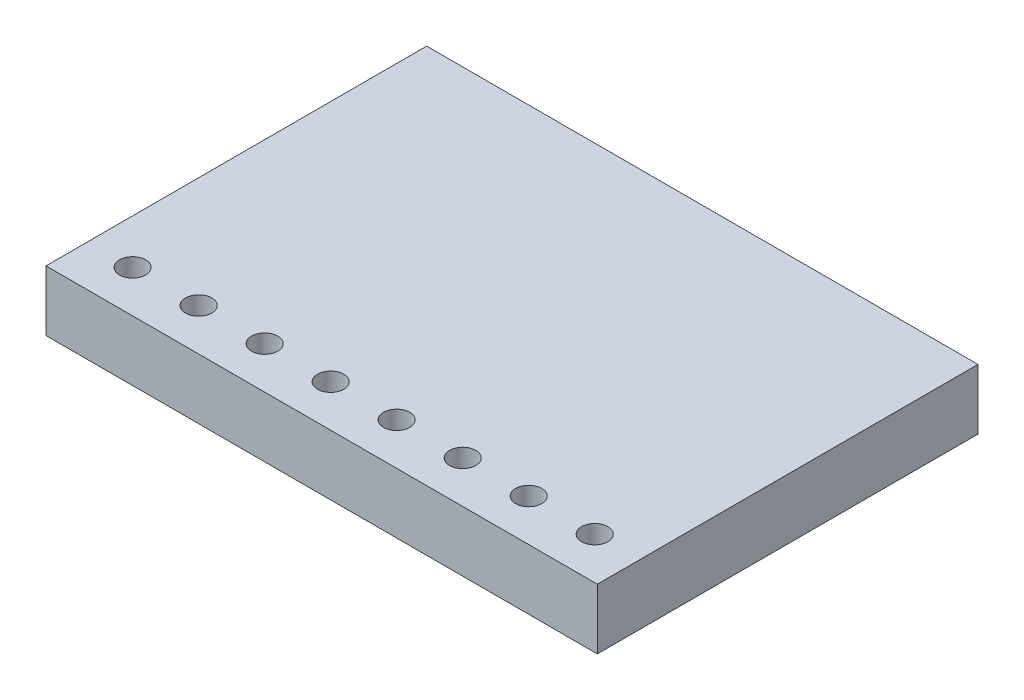
ISO-10303-21;
HEADER;
FILE_DESCRIPTION(('STEP AP214'),'2;1');
FILE_NAME('part.step','',(''),(''),'','','');
FILE_SCHEMA(('AUTOMOTIVE_DESIGN { 1 0 10303 214 1 1 1 1 }'));
ENDSEC;
DATA;
#1=APPLICATION_CONTEXT('core data for automotive mechanical design processes');
#2=APPLICATION_PROTOCOL_DEFINITION('international standard','automotive_design',2000,#1);
#3=PRODUCT_CONTEXT('',#1,'mechanical');
#4=PRODUCT('Part','Part','',(#3));
#5=PRODUCT_RELATED_PRODUCT_CATEGORY('part','',(#4));
#6=PRODUCT_DEFINITION_FORMATION('','',#4);
#7=PRODUCT_DEFINITION_CONTEXT('part definition',#1,'design');
#8=PRODUCT_DEFINITION('design','',#6,#7);
#9=PRODUCT_DEFINITION_SHAPE('','',#8);
#10=(LENGTH_UNIT() NAMED_UNIT(*) SI_UNIT(.MILLI.,.METRE.));
#11=(NAMED_UNIT(*) PLANE_ANGLE_UNIT() SI_UNIT($,.RADIAN.));
#12=(NAMED_UNIT(*) SI_UNIT($,.STERADIAN.) SOLID_ANGLE_UNIT());
#13=UNCERTAINTY_MEASURE_WITH_UNIT(LENGTH_MEASURE(1.E-05),#10,'distance_accuracy_value','');
#14=(GEOMETRIC_REPRESENTATION_CONTEXT(3) GLOBAL_UNCERTAINTY_ASSIGNED_CONTEXT((#13)) GLOBAL_UNIT_ASSIGNED_CONTEXT((#10,
#11,#12)) REPRESENTATION_CONTEXT('',''));
#15=CARTESIAN_POINT('',(0.,0.,0.));
#16=DIRECTION('',(0.,0.,1.));
#17=DIRECTION('',(1.,0.,0.));
#18=AXIS2_PLACEMENT_3D('',#15,#16,#17);
#19=CARTESIAN_POINT('',(10.5,2.3,7.24999999999999));
#20=DIRECTION('',(-1.,0.,0.));
#21=DIRECTION('',(0.,0.,1.));
#22=AXIS2_PLACEMENT_3D('',#19,#20,#21);
#23=PLANE('',#22);
#24=DIRECTION('',(0.,0.,-1.));
#25=VECTOR('',#24,1.);
#26=CARTESIAN_POINT('',(10.5,0.,7.24999999999999));
#27=LINE('',#26,#25);
#28=CARTESIAN_POINT('',(10.5,0.,7.24999999999999));
#29=VERTEX_POINT('',#28);
#30=CARTESIAN_POINT('',(10.5,0.,-7.25000000000001));
#31=VERTEX_POINT('',#30);
#32=EDGE_CURVE('E107',#29,#31,#27,.T.);
#33=ORIENTED_EDGE('',*,*,#32,.T.);
#34=DIRECTION('',(0.,-1.,0.));
#35=VECTOR('',#34,1.);
#36=CARTESIAN_POINT('',(10.5,2.3,-7.25000000000001));
#37=LINE('',#36,#35);
#38=CARTESIAN_POINT('',(10.5,2.3,-7.25000000000001));
#39=VERTEX_POINT('',#38);
#40=EDGE_CURVE('E11',#39,#31,#37,.T.);
#41=ORIENTED_EDGE('',*,*,#40,.F.);
#42=DIRECTION('',(0.,0.,-1.));
#43=VECTOR('',#42,1.);
#44=CARTESIAN_POINT('',(10.5,2.3,7.24999999999999));
#45=LINE('',#44,#43);
#46=CARTESIAN_POINT('',(10.5,2.3,7.24999999999999));
#47=VERTEX_POINT('',#46);
#48=EDGE_CURVE('E91',#47,#39,#45,.T.);
#49=ORIENTED_EDGE('',*,*,#48,.F.);
#50=DIRECTION('',(0.,-1.,0.));
#51=VECTOR('',#50,1.);
#52=CARTESIAN_POINT('',(10.5,2.3,7.24999999999999));
#53=LINE('',#52,#51);
#54=EDGE_CURVE('E103',#47,#29,#53,.T.);
#55=ORIENTED_EDGE('',*,*,#54,.T.);
#56=EDGE_LOOP('',(#33,#41,#49,#55));
#57=FACE_BOUND('',#56,.T.);
#58=ADVANCED_FACE('F39',(#57),#23,.F.);
#59=CARTESIAN_POINT('',(-10.5,2.3,-7.25000000000001));
#60=DIRECTION('',(0.,0.,1.));
#61=DIRECTION('',(1.,0.,0.));
#62=AXIS2_PLACEMENT_3D('',#59,#60,#61);
#63=PLANE('',#62);
#64=DIRECTION('',(-1.,0.,0.));
#65=VECTOR('',#64,1.);
#66=CARTESIAN_POINT('',(-10.5,0.,-7.25000000000001));
#67=LINE('',#66,#65);
#68=CARTESIAN_POINT('',(-10.5,0.,-7.25000000000001));
#69=VERTEX_POINT('',#68);
#70=EDGE_CURVE('E96',#31,#69,#67,.T.);
#71=ORIENTED_EDGE('',*,*,#70,.T.);
#72=DIRECTION('',(0.,-1.,0.));
#73=VECTOR('',#72,1.);
#74=CARTESIAN_POINT('',(-10.5,2.3,-7.25000000000001));
#75=LINE('',#74,#73);
#76=CARTESIAN_POINT('',(-10.5,2.3,-7.25000000000001));
#77=VERTEX_POINT('',#76);
#78=EDGE_CURVE('E48',#77,#69,#75,.T.);
#79=ORIENTED_EDGE('',*,*,#78,.F.);
#80=DIRECTION('',(-1.,0.,0.));
#81=VECTOR('',#80,1.);
#82=CARTESIAN_POINT('',(-10.5,2.3,-7.25000000000001));
#83=LINE('',#82,#81);
#84=EDGE_CURVE('E86',#39,#77,#83,.T.);
#85=ORIENTED_EDGE('',*,*,#84,.F.);
#86=ORIENTED_EDGE('',*,*,#40,.T.);
#87=EDGE_LOOP('',(#71,#79,#85,#86));
#88=FACE_BOUND('',#87,.T.);
#89=ADVANCED_FACE('F95',(#88),#63,.F.);
#90=CARTESIAN_POINT('',(-10.5,2.3,7.24999999999999));
#91=DIRECTION('',(1.,0.,0.));
#92=DIRECTION('',(0.,0.,-1.));
#93=AXIS2_PLACEMENT_3D('',#90,#91,#92);
#94=PLANE('',#93);
#95=DIRECTION('',(0.,0.,1.));
#96=VECTOR('',#95,1.);
#97=CARTESIAN_POINT('',(-10.5,0.,7.24999999999999));
#98=LINE('',#97,#96);
#99=CARTESIAN_POINT('',(-10.5,0.,7.24999999999999));
#100=VERTEX_POINT('',#99);
#101=EDGE_CURVE('E73',#69,#100,#98,.T.);
#102=ORIENTED_EDGE('',*,*,#101,.T.);
#103=DIRECTION('',(0.,-1.,0.));
#104=VECTOR('',#103,1.);
#105=CARTESIAN_POINT('',(-10.5,2.3,7.24999999999999));
#106=LINE('',#105,#104);
#107=CARTESIAN_POINT('',(-10.5,2.3,7.24999999999999));
#108=VERTEX_POINT('',#107);
#109=EDGE_CURVE('E98',#108,#100,#106,.T.);
#110=ORIENTED_EDGE('',*,*,#109,.F.);
#111=DIRECTION('',(0.,0.,1.));
#112=VECTOR('',#111,1.);
#113=CARTESIAN_POINT('',(-10.5,2.3,7.24999999999999));
#114=LINE('',#113,#112);
#115=EDGE_CURVE('E89',#77,#108,#114,.T.);
#116=ORIENTED_EDGE('',*,*,#115,.F.);
#117=ORIENTED_EDGE('',*,*,#78,.T.);
#118=EDGE_LOOP('',(#102,#110,#116,#117));
#119=FACE_BOUND('',#118,.T.);
#120=ADVANCED_FACE('F99',(#119),#94,.F.);
#121=CARTESIAN_POINT('',(-10.5,2.3,7.24999999999999));
#122=DIRECTION('',(0.,0.,-1.));
#123=DIRECTION('',(-1.,0.,0.));
#124=AXIS2_PLACEMENT_3D('',#121,#122,#123);
#125=PLANE('',#124);
#126=DIRECTION('',(1.,0.,0.));
#127=VECTOR('',#126,1.);
#128=CARTESIAN_POINT('',(-10.5,0.,7.24999999999999));
#129=LINE('',#128,#127);
#130=EDGE_CURVE('E79',#100,#29,#129,.T.);
#131=ORIENTED_EDGE('',*,*,#130,.T.);
#132=ORIENTED_EDGE('',*,*,#54,.F.);
#133=DIRECTION('',(1.,0.,0.));
#134=VECTOR('',#133,1.);
#135=CARTESIAN_POINT('',(-10.5,2.3,7.24999999999999));
#136=LINE('',#135,#134);
#137=EDGE_CURVE('E56',#108,#47,#136,.T.);
#138=ORIENTED_EDGE('',*,*,#137,.F.);
#139=ORIENTED_EDGE('',*,*,#109,.T.);
#140=EDGE_LOOP('',(#131,#132,#138,#139));
#141=FACE_BOUND('',#140,.T.);
#142=ADVANCED_FACE('F121',(#141),#125,.F.);
#143=CARTESIAN_POINT('',(0.,2.3,0.));
#144=DIRECTION('',(0.,-1.,0.));
#145=DIRECTION('',(0.,0.,-1.));
#146=AXIS2_PLACEMENT_3D('',#143,#144,#145);
#147=PLANE('',#146);
#148=CARTESIAN_POINT('',(-8.79999999999998,2.3,5.64999999999999));
#149=DIRECTION('',(0.,1.,0.));
#150=DIRECTION('',(0.,0.,1.));
#151=AXIS2_PLACEMENT_3D('',#148,#149,#150);
#152=CIRCLE('',#151,0.500000000000001);
#153=CARTESIAN_POINT('',(-8.79999999999998,2.3,6.14999999999999));
#154=VERTEX_POINT('',#153);
#155=EDGE_CURVE('E184',#154,#154,#152,.T.);
#156=ORIENTED_EDGE('',*,*,#155,.F.);
#157=EDGE_LOOP('',(#156));
#158=FACE_BOUND('',#157,.T.);
#159=CARTESIAN_POINT('',(-6.28571428571427,2.3,5.64999999999999));
#160=DIRECTION('',(0.,1.,0.));
#161=DIRECTION('',(0.,0.,1.));
#162=AXIS2_PLACEMENT_3D('',#159,#160,#161);
#163=CIRCLE('',#162,0.500000000000002);
#164=CARTESIAN_POINT('',(-6.28571428571427,2.3,6.14999999999999));
#165=VERTEX_POINT('',#164);
#166=EDGE_CURVE('E176',#165,#165,#163,.T.);
#167=ORIENTED_EDGE('',*,*,#166,.F.);
#168=EDGE_LOOP('',(#167));
#169=FACE_BOUND('',#168,.T.);
#170=CARTESIAN_POINT('',(-3.77142857142856,2.3,5.64999999999999));
#171=DIRECTION('',(0.,1.,0.));
#172=DIRECTION('',(0.,0.,1.));
#173=AXIS2_PLACEMENT_3D('',#170,#171,#172);
#174=CIRCLE('',#173,0.500000000000001);
#175=CARTESIAN_POINT('',(-3.77142857142856,2.3,6.14999999999999));
#176=VERTEX_POINT('',#175);
#177=EDGE_CURVE('E168',#176,#176,#174,.T.);
#178=ORIENTED_EDGE('',*,*,#177,.F.);
#179=EDGE_LOOP('',(#178));
#180=FACE_BOUND('',#179,.T.);
#181=CARTESIAN_POINT('',(-1.25714285714284,2.3,5.64999999999999));
#182=DIRECTION('',(0.,1.,0.));
#183=DIRECTION('',(0.,0.,1.));
#184=AXIS2_PLACEMENT_3D('',#181,#182,#183);
#185=CIRCLE('',#184,0.500000000000001);
#186=CARTESIAN_POINT('',(-1.25714285714284,2.3,6.14999999999999));
#187=VERTEX_POINT('',#186);
#188=EDGE_CURVE('E160',#187,#187,#185,.T.);
#189=ORIENTED_EDGE('',*,*,#188,.F.);
#190=EDGE_LOOP('',(#189));
#191=FACE_BOUND('',#190,.T.);
#192=CARTESIAN_POINT('',(1.25714285714287,2.3,5.64999999999999));
#193=DIRECTION('',(0.,1.,0.));
#194=DIRECTION('',(0.,0.,1.));
#195=AXIS2_PLACEMENT_3D('',#192,#193,#194);
#196=CIRCLE('',#195,0.500000000000001);
#197=CARTESIAN_POINT('',(1.25714285714287,2.3,6.14999999999999));
#198=VERTEX_POINT('',#197);
#199=EDGE_CURVE('E152',#198,#198,#196,.T.);
#200=ORIENTED_EDGE('',*,*,#199,.F.);
#201=EDGE_LOOP('',(#200));
#202=FACE_BOUND('',#201,.T.);
#203=CARTESIAN_POINT('',(3.77142857142859,2.3,5.64999999999999));
#204=DIRECTION('',(0.,1.,0.));
#205=DIRECTION('',(0.,0.,1.));
#206=AXIS2_PLACEMENT_3D('',#203,#204,#205);
#207=CIRCLE('',#206,0.500000000000001);
#208=CARTESIAN_POINT('',(3.77142857142859,2.3,6.14999999999999));
#209=VERTEX_POINT('',#208);
#210=EDGE_CURVE('E144',#209,#209,#207,.T.);
#211=ORIENTED_EDGE('',*,*,#210,.F.);
#212=EDGE_LOOP('',(#211));
#213=FACE_BOUND('',#212,.T.);
#214=CARTESIAN_POINT('',(6.2857142857143,2.3,5.64999999999999));
#215=DIRECTION('',(0.,1.,0.));
#216=DIRECTION('',(0.,0.,1.));
#217=AXIS2_PLACEMENT_3D('',#214,#215,#216);
#218=CIRCLE('',#217,0.500000000000001);
#219=CARTESIAN_POINT('',(6.2857142857143,2.3,6.14999999999999));
#220=VERTEX_POINT('',#219);
#221=EDGE_CURVE('E136',#220,#220,#218,.T.);
#222=ORIENTED_EDGE('',*,*,#221,.F.);
#223=EDGE_LOOP('',(#222));
#224=FACE_BOUND('',#223,.T.);
#225=CARTESIAN_POINT('',(8.80000000000002,2.3,5.64999999999999));
#226=DIRECTION('',(0.,1.,0.));
#227=DIRECTION('',(0.,0.,1.));
#228=AXIS2_PLACEMENT_3D('',#225,#226,#227);
#229=CIRCLE('',#228,0.500000000000001);
#230=CARTESIAN_POINT('',(8.80000000000002,2.3,6.14999999999999));
#231=VERTEX_POINT('',#230);
#232=EDGE_CURVE('E128',#231,#231,#229,.T.);
#233=ORIENTED_EDGE('',*,*,#232,.F.);
#234=EDGE_LOOP('',(#233));
#235=FACE_BOUND('',#234,.T.);
#236=ORIENTED_EDGE('',*,*,#48,.T.);
#237=ORIENTED_EDGE('',*,*,#84,.T.);
#238=ORIENTED_EDGE('',*,*,#115,.T.);
#239=ORIENTED_EDGE('',*,*,#137,.T.);
#240=EDGE_LOOP('',(#236,#237,#238,#239));
#241=FACE_BOUND('',#240,.T.);
#242=ADVANCED_FACE('F87',(#158,#169,#180,#191,#202,#213,#224,#235,#241),#147,.F.);
#243=CARTESIAN_POINT('',(0.,0.,0.));
#244=DIRECTION('',(0.,-1.,0.));
#245=DIRECTION('',(0.,0.,-1.));
#246=AXIS2_PLACEMENT_3D('',#243,#244,#245);
#247=PLANE('',#246);
#248=CARTESIAN_POINT('',(-8.79999999999998,0.,5.64999999999999));
#249=DIRECTION('',(0.,1.,0.));
#250=DIRECTION('',(0.,0.,1.));
#251=AXIS2_PLACEMENT_3D('',#248,#249,#250);
#252=CIRCLE('',#251,0.500000000000001);
#253=CARTESIAN_POINT('',(-8.79999999999998,0.,6.14999999999999));
#254=VERTEX_POINT('',#253);
#255=EDGE_CURVE('E111',#254,#254,#252,.T.);
#256=ORIENTED_EDGE('',*,*,#255,.T.);
#257=EDGE_LOOP('',(#256));
#258=FACE_BOUND('',#257,.T.);
#259=CARTESIAN_POINT('',(-6.28571428571427,0.,5.64999999999999));
#260=DIRECTION('',(0.,1.,0.));
#261=DIRECTION('',(0.,0.,1.));
#262=AXIS2_PLACEMENT_3D('',#259,#260,#261);
#263=CIRCLE('',#262,0.500000000000002);
#264=CARTESIAN_POINT('',(-6.28571428571427,0.,6.14999999999999));
#265=VERTEX_POINT('',#264);
#266=EDGE_CURVE('E180',#265,#265,#263,.T.);
#267=ORIENTED_EDGE('',*,*,#266,.T.);
#268=EDGE_LOOP('',(#267));
#269=FACE_BOUND('',#268,.T.);
#270=CARTESIAN_POINT('',(-3.77142857142856,0.,5.64999999999999));
#271=DIRECTION('',(0.,1.,0.));
#272=DIRECTION('',(0.,0.,1.));
#273=AXIS2_PLACEMENT_3D('',#270,#271,#272);
#274=CIRCLE('',#273,0.500000000000001);
#275=CARTESIAN_POINT('',(-3.77142857142856,0.,6.14999999999999));
#276=VERTEX_POINT('',#275);
#277=EDGE_CURVE('E172',#276,#276,#274,.T.);
#278=ORIENTED_EDGE('',*,*,#277,.T.);
#279=EDGE_LOOP('',(#278));
#280=FACE_BOUND('',#279,.T.);
#281=CARTESIAN_POINT('',(-1.25714285714284,0.,5.64999999999999));
#282=DIRECTION('',(0.,1.,0.));
#283=DIRECTION('',(0.,0.,1.));
#284=AXIS2_PLACEMENT_3D('',#281,#282,#283);
#285=CIRCLE('',#284,0.500000000000001);
#286=CARTESIAN_POINT('',(-1.25714285714284,0.,6.14999999999999));
#287=VERTEX_POINT('',#286);
#288=EDGE_CURVE('E164',#287,#287,#285,.T.);
#289=ORIENTED_EDGE('',*,*,#288,.T.);
#290=EDGE_LOOP('',(#289));
#291=FACE_BOUND('',#290,.T.);
#292=CARTESIAN_POINT('',(1.25714285714287,0.,5.64999999999999));
#293=DIRECTION('',(0.,1.,0.));
#294=DIRECTION('',(0.,0.,1.));
#295=AXIS2_PLACEMENT_3D('',#292,#293,#294);
#296=CIRCLE('',#295,0.500000000000001);
#297=CARTESIAN_POINT('',(1.25714285714287,0.,6.14999999999999));
#298=VERTEX_POINT('',#297);
#299=EDGE_CURVE('E156',#298,#298,#296,.T.);
#300=ORIENTED_EDGE('',*,*,#299,.T.);
#301=EDGE_LOOP('',(#300));
#302=FACE_BOUND('',#301,.T.);
#303=CARTESIAN_POINT('',(3.77142857142859,0.,5.64999999999999));
#304=DIRECTION('',(0.,1.,0.));
#305=DIRECTION('',(0.,0.,1.));
#306=AXIS2_PLACEMENT_3D('',#303,#304,#305);
#307=CIRCLE('',#306,0.500000000000001);
#308=CARTESIAN_POINT('',(3.77142857142859,0.,6.14999999999999));
#309=VERTEX_POINT('',#308);
#310=EDGE_CURVE('E148',#309,#309,#307,.T.);
#311=ORIENTED_EDGE('',*,*,#310,.T.);
#312=EDGE_LOOP('',(#311));
#313=FACE_BOUND('',#312,.T.);
#314=CARTESIAN_POINT('',(6.2857142857143,0.,5.64999999999999));
#315=DIRECTION('',(0.,1.,0.));
#316=DIRECTION('',(0.,0.,1.));
#317=AXIS2_PLACEMENT_3D('',#314,#315,#316);
#318=CIRCLE('',#317,0.500000000000001);
#319=CARTESIAN_POINT('',(6.2857142857143,0.,6.14999999999999));
#320=VERTEX_POINT('',#319);
#321=EDGE_CURVE('E140',#320,#320,#318,.T.);
#322=ORIENTED_EDGE('',*,*,#321,.T.);
#323=EDGE_LOOP('',(#322));
#324=FACE_BOUND('',#323,.T.);
#325=CARTESIAN_POINT('',(8.80000000000002,0.,5.64999999999999));
#326=DIRECTION('',(0.,1.,0.));
#327=DIRECTION('',(0.,0.,1.));
#328=AXIS2_PLACEMENT_3D('',#325,#326,#327);
#329=CIRCLE('',#328,0.500000000000001);
#330=CARTESIAN_POINT('',(8.80000000000002,0.,6.14999999999999));
#331=VERTEX_POINT('',#330);
#332=EDGE_CURVE('E132',#331,#331,#329,.T.);
#333=ORIENTED_EDGE('',*,*,#332,.T.);
#334=EDGE_LOOP('',(#333));
#335=FACE_BOUND('',#334,.T.);
#336=ORIENTED_EDGE('',*,*,#32,.F.);
#337=ORIENTED_EDGE('',*,*,#130,.F.);
#338=ORIENTED_EDGE('',*,*,#101,.F.);
#339=ORIENTED_EDGE('',*,*,#70,.F.);
#340=EDGE_LOOP('',(#336,#337,#338,#339));
#341=FACE_BOUND('',#340,.T.);
#342=ADVANCED_FACE('F124',(#258,#269,#280,#291,#302,#313,#324,#335,#341),#247,.T.);
#343=CARTESIAN_POINT('',(8.80000000000002,0.,5.64999999999999));
#344=DIRECTION('',(0.,1.,0.));
#345=DIRECTION('',(0.,0.,1.));
#346=AXIS2_PLACEMENT_3D('',#343,#344,#345);
#347=CYLINDRICAL_SURFACE('',#346,0.500000000000001);
#348=ORIENTED_EDGE('',*,*,#332,.F.);
#349=EDGE_LOOP('',(#348));
#350=FACE_BOUND('',#349,.T.);
#351=ORIENTED_EDGE('',*,*,#232,.T.);
#352=EDGE_LOOP('',(#351));
#353=FACE_BOUND('',#352,.T.);
#354=ADVANCED_FACE('F218',(#350,#353),#347,.F.);
#355=CARTESIAN_POINT('',(6.2857142857143,0.,5.64999999999999));
#356=DIRECTION('',(0.,1.,0.));
#357=DIRECTION('',(0.,0.,1.));
#358=AXIS2_PLACEMENT_3D('',#355,#356,#357);
#359=CYLINDRICAL_SURFACE('',#358,0.500000000000001);
#360=ORIENTED_EDGE('',*,*,#321,.F.);
#361=EDGE_LOOP('',(#360));
#362=FACE_BOUND('',#361,.T.);
#363=ORIENTED_EDGE('',*,*,#221,.T.);
#364=EDGE_LOOP('',(#363));
#365=FACE_BOUND('',#364,.T.);
#366=ADVANCED_FACE('F220',(#362,#365),#359,.F.);
#367=CARTESIAN_POINT('',(3.77142857142859,0.,5.64999999999999));
#368=DIRECTION('',(0.,1.,0.));
#369=DIRECTION('',(0.,0.,1.));
#370=AXIS2_PLACEMENT_3D('',#367,#368,#369);
#371=CYLINDRICAL_SURFACE('',#370,0.500000000000001);
#372=ORIENTED_EDGE('',*,*,#310,.F.);
#373=EDGE_LOOP('',(#372));
#374=FACE_BOUND('',#373,.T.);
#375=ORIENTED_EDGE('',*,*,#210,.T.);
#376=EDGE_LOOP('',(#375));
#377=FACE_BOUND('',#376,.T.);
#378=ADVANCED_FACE('F227',(#374,#377),#371,.F.);
#379=CARTESIAN_POINT('',(1.25714285714287,0.,5.64999999999999));
#380=DIRECTION('',(0.,1.,0.));
#381=DIRECTION('',(0.,0.,1.));
#382=AXIS2_PLACEMENT_3D('',#379,#380,#381);
#383=CYLINDRICAL_SURFACE('',#382,0.500000000000001);
#384=ORIENTED_EDGE('',*,*,#299,.F.);
#385=EDGE_LOOP('',(#384));
#386=FACE_BOUND('',#385,.T.);
#387=ORIENTED_EDGE('',*,*,#199,.T.);
#388=EDGE_LOOP('',(#387));
#389=FACE_BOUND('',#388,.T.);
#390=ADVANCED_FACE('F273',(#386,#389),#383,.F.);
#391=CARTESIAN_POINT('',(-1.25714285714284,0.,5.64999999999999));
#392=DIRECTION('',(0.,1.,0.));
#393=DIRECTION('',(0.,0.,1.));
#394=AXIS2_PLACEMENT_3D('',#391,#392,#393);
#395=CYLINDRICAL_SURFACE('',#394,0.500000000000001);
#396=ORIENTED_EDGE('',*,*,#288,.F.);
#397=EDGE_LOOP('',(#396));
#398=FACE_BOUND('',#397,.T.);
#399=ORIENTED_EDGE('',*,*,#188,.T.);
#400=EDGE_LOOP('',(#399));
#401=FACE_BOUND('',#400,.T.);
#402=ADVANCED_FACE('F283',(#398,#401),#395,.F.);
#403=CARTESIAN_POINT('',(-3.77142857142856,0.,5.64999999999999));
#404=DIRECTION('',(0.,1.,0.));
#405=DIRECTION('',(0.,0.,1.));
#406=AXIS2_PLACEMENT_3D('',#403,#404,#405);
#407=CYLINDRICAL_SURFACE('',#406,0.500000000000001);
#408=ORIENTED_EDGE('',*,*,#277,.F.);
#409=EDGE_LOOP('',(#408));
#410=FACE_BOUND('',#409,.T.);
#411=ORIENTED_EDGE('',*,*,#177,.T.);
#412=EDGE_LOOP('',(#411));
#413=FACE_BOUND('',#412,.T.);
#414=ADVANCED_FACE('F293',(#410,#413),#407,.F.);
#415=CARTESIAN_POINT('',(-6.28571428571427,0.,5.64999999999999));
#416=DIRECTION('',(0.,1.,0.));
#417=DIRECTION('',(0.,0.,1.));
#418=AXIS2_PLACEMENT_3D('',#415,#416,#417);
#419=CYLINDRICAL_SURFACE('',#418,0.500000000000002);
#420=ORIENTED_EDGE('',*,*,#266,.F.);
#421=EDGE_LOOP('',(#420));
#422=FACE_BOUND('',#421,.T.);
#423=ORIENTED_EDGE('',*,*,#166,.T.);
#424=EDGE_LOOP('',(#423));
#425=FACE_BOUND('',#424,.T.);
#426=ADVANCED_FACE('F197',(#422,#425),#419,.F.);
#427=CARTESIAN_POINT('',(-8.79999999999998,0.,5.64999999999999));
#428=DIRECTION('',(0.,1.,0.));
#429=DIRECTION('',(0.,0.,1.));
#430=AXIS2_PLACEMENT_3D('',#427,#428,#429);
#431=CYLINDRICAL_SURFACE('',#430,0.500000000000001);
#432=ORIENTED_EDGE('',*,*,#255,.F.);
#433=EDGE_LOOP('',(#432));
#434=FACE_BOUND('',#433,.T.);
#435=ORIENTED_EDGE('',*,*,#155,.T.);
#436=EDGE_LOOP('',(#435));
#437=FACE_BOUND('',#436,.T.);
#438=ADVANCED_FACE('F194',(#434,#437),#431,.F.);
#439=CLOSED_SHELL('',(#58,#89,#120,#142,#242,#342,#354,#366,#378,#390,#402,#414,#426,#438));
#440=MANIFOLD_SOLID_BREP('B2',#439);
#441=ADVANCED_BREP_SHAPE_REPRESENTATION('',(#18,#440),#14);
#442=SHAPE_DEFINITION_REPRESENTATION(#9,#441);
ENDSEC;
END-ISO-10303-21;
